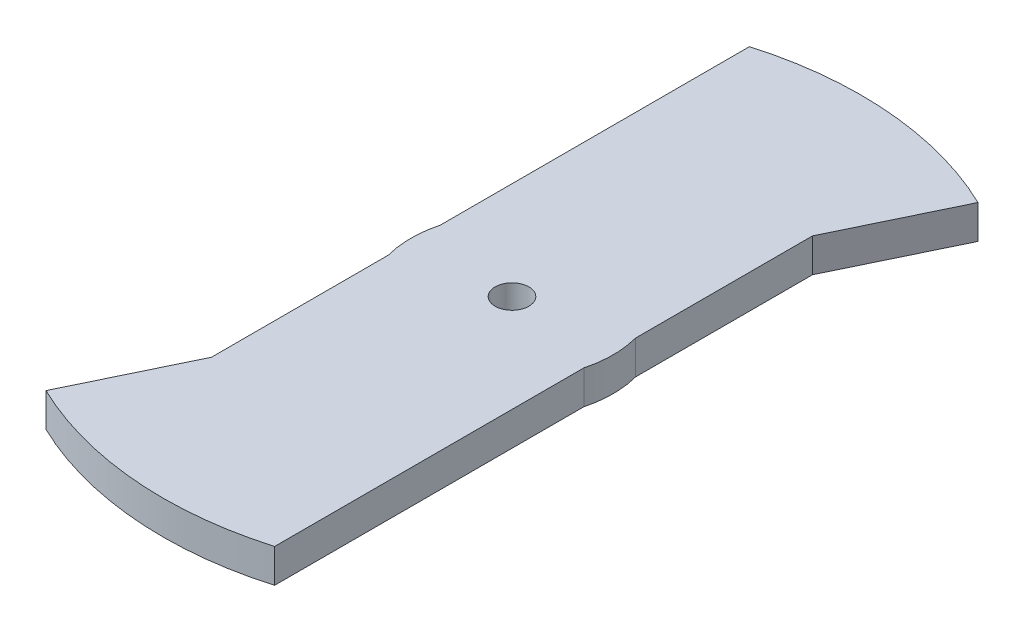
ISO-10303-21;
HEADER;
FILE_DESCRIPTION(('STEP AP214'),'2;1');
FILE_NAME('part.step','',(''),(''),'','','');
FILE_SCHEMA(('AUTOMOTIVE_DESIGN { 1 0 10303 214 1 1 1 1 }'));
ENDSEC;
DATA;
#1=APPLICATION_CONTEXT('core data for automotive mechanical design processes');
#2=APPLICATION_PROTOCOL_DEFINITION('international standard','automotive_design',2000,#1);
#3=PRODUCT_CONTEXT('',#1,'mechanical');
#4=PRODUCT('Part','Part','',(#3));
#5=PRODUCT_RELATED_PRODUCT_CATEGORY('part','',(#4));
#6=PRODUCT_DEFINITION_FORMATION('','',#4);
#7=PRODUCT_DEFINITION_CONTEXT('part definition',#1,'design');
#8=PRODUCT_DEFINITION('design','',#6,#7);
#9=PRODUCT_DEFINITION_SHAPE('','',#8);
#10=(LENGTH_UNIT() NAMED_UNIT(*) SI_UNIT(.MILLI.,.METRE.));
#11=(NAMED_UNIT(*) PLANE_ANGLE_UNIT() SI_UNIT($,.RADIAN.));
#12=(NAMED_UNIT(*) SI_UNIT($,.STERADIAN.) SOLID_ANGLE_UNIT());
#13=UNCERTAINTY_MEASURE_WITH_UNIT(LENGTH_MEASURE(1.E-05),#10,'distance_accuracy_value','');
#14=(GEOMETRIC_REPRESENTATION_CONTEXT(3) GLOBAL_UNCERTAINTY_ASSIGNED_CONTEXT((#13)) GLOBAL_UNIT_ASSIGNED_CONTEXT((#10,
#11,#12)) REPRESENTATION_CONTEXT('',''));
#15=CARTESIAN_POINT('',(0.,0.,0.));
#16=DIRECTION('',(0.,0.,1.));
#17=DIRECTION('',(1.,0.,0.));
#18=AXIS2_PLACEMENT_3D('',#15,#16,#17);
#19=CARTESIAN_POINT('',(0.,6.35,0.));
#20=DIRECTION('',(0.,-1.,0.));
#21=DIRECTION('',(0.,0.,-1.));
#22=AXIS2_PLACEMENT_3D('',#19,#20,#21);
#23=CYLINDRICAL_SURFACE('',#22,19.05);
#24=CARTESIAN_POINT('',(0.,0.,0.));
#25=DIRECTION('',(0.,1.,0.));
#26=DIRECTION('',(0.,0.,1.));
#27=AXIS2_PLACEMENT_3D('',#24,#25,#26);
#28=CIRCLE('',#27,19.05);
#29=CARTESIAN_POINT('',(18.415,0.,-4.87752754989657));
#30=VERTEX_POINT('',#29);
#31=CARTESIAN_POINT('',(18.415,0.,4.87752754989658));
#32=VERTEX_POINT('',#31);
#33=EDGE_CURVE('E147',#30,#32,#28,.F.);
#34=ORIENTED_EDGE('',*,*,#33,.F.);
#35=DIRECTION('',(0.,-1.,0.));
#36=VECTOR('',#35,1.);
#37=CARTESIAN_POINT('',(18.415,6.35,-4.87752754989657));
#38=LINE('',#37,#36);
#39=CARTESIAN_POINT('',(18.415,6.35,-4.87752754989657));
#40=VERTEX_POINT('',#39);
#41=EDGE_CURVE('E11',#40,#30,#38,.T.);
#42=ORIENTED_EDGE('',*,*,#41,.F.);
#43=CARTESIAN_POINT('',(0.,6.35,0.));
#44=DIRECTION('',(0.,1.,0.));
#45=DIRECTION('',(0.,0.,1.));
#46=AXIS2_PLACEMENT_3D('',#43,#44,#45);
#47=CIRCLE('',#46,19.05);
#48=CARTESIAN_POINT('',(18.415,6.35,4.87752754989658));
#49=VERTEX_POINT('',#48);
#50=EDGE_CURVE('E172',#40,#49,#47,.F.);
#51=ORIENTED_EDGE('',*,*,#50,.T.);
#52=DIRECTION('',(0.,-1.,0.));
#53=VECTOR('',#52,1.);
#54=CARTESIAN_POINT('',(18.415,6.35,4.87752754989658));
#55=LINE('',#54,#53);
#56=EDGE_CURVE('E93',#49,#32,#55,.T.);
#57=ORIENTED_EDGE('',*,*,#56,.T.);
#58=EDGE_LOOP('',(#34,#42,#51,#57));
#59=FACE_BOUND('',#58,.T.);
#60=ADVANCED_FACE('F37',(#59),#23,.T.);
#61=CARTESIAN_POINT('',(18.415,6.35,0.));
#62=DIRECTION('',(-1.,0.,0.));
#63=DIRECTION('',(0.,0.,1.));
#64=AXIS2_PLACEMENT_3D('',#61,#62,#63);
#65=PLANE('',#64);
#66=DIRECTION('',(0.,0.,-1.));
#67=VECTOR('',#66,1.);
#68=CARTESIAN_POINT('',(18.415,0.,0.));
#69=LINE('',#68,#67);
#70=CARTESIAN_POINT('',(18.415,0.,-38.2122297046378));
#71=VERTEX_POINT('',#70);
#72=EDGE_CURVE('E150',#30,#71,#69,.T.);
#73=ORIENTED_EDGE('',*,*,#72,.T.);
#74=DIRECTION('',(0.,-1.,0.));
#75=VECTOR('',#74,1.);
#76=CARTESIAN_POINT('',(18.415,6.35,-38.2122297046378));
#77=LINE('',#76,#75);
#78=CARTESIAN_POINT('',(18.415,6.35,-38.2122297046378));
#79=VERTEX_POINT('',#78);
#80=EDGE_CURVE('E45',#79,#71,#77,.T.);
#81=ORIENTED_EDGE('',*,*,#80,.F.);
#82=DIRECTION('',(0.,0.,-1.));
#83=VECTOR('',#82,1.);
#84=CARTESIAN_POINT('',(18.415,6.35,0.));
#85=LINE('',#84,#83);
#86=EDGE_CURVE('E211',#40,#79,#85,.T.);
#87=ORIENTED_EDGE('',*,*,#86,.F.);
#88=ORIENTED_EDGE('',*,*,#41,.T.);
#89=EDGE_LOOP('',(#73,#81,#87,#88));
#90=FACE_BOUND('',#89,.T.);
#91=ADVANCED_FACE('F225',(#90),#65,.F.);
#92=CARTESIAN_POINT('',(0.,6.35,0.));
#93=DIRECTION('',(-0.90084939659196,0.,-0.434131736526946));
#94=DIRECTION('',(-0.434131736526946,0.,0.90084939659196));
#95=AXIS2_PLACEMENT_3D('',#92,#93,#94);
#96=PLANE('',#95);
#97=DIRECTION('',(0.434131736526946,0.,-0.90084939659196));
#98=VECTOR('',#97,1.);
#99=CARTESIAN_POINT('',(0.,0.,0.));
#100=LINE('',#99,#98);
#101=CARTESIAN_POINT('',(28.5597904191617,0.,-59.2632784041987));
#102=VERTEX_POINT('',#101);
#103=EDGE_CURVE('E152',#71,#102,#100,.T.);
#104=ORIENTED_EDGE('',*,*,#103,.T.);
#105=DIRECTION('',(0.,-1.,0.));
#106=VECTOR('',#105,1.);
#107=CARTESIAN_POINT('',(28.5597904191617,6.35,-59.2632784041987));
#108=LINE('',#107,#106);
#109=CARTESIAN_POINT('',(28.5597904191617,6.35,-59.2632784041987));
#110=VERTEX_POINT('',#109);
#111=EDGE_CURVE('E184',#110,#102,#108,.T.);
#112=ORIENTED_EDGE('',*,*,#111,.F.);
#113=DIRECTION('',(0.434131736526946,0.,-0.90084939659196));
#114=VECTOR('',#113,1.);
#115=CARTESIAN_POINT('',(0.,6.35,0.));
#116=LINE('',#115,#114);
#117=EDGE_CURVE('E192',#79,#110,#116,.T.);
#118=ORIENTED_EDGE('',*,*,#117,.F.);
#119=ORIENTED_EDGE('',*,*,#80,.T.);
#120=EDGE_LOOP('',(#104,#112,#118,#119));
#121=FACE_BOUND('',#120,.T.);
#122=ADVANCED_FACE('F190',(#121),#96,.F.);
#123=CARTESIAN_POINT('',(0.,6.35,0.));
#124=DIRECTION('',(0.,-1.,0.));
#125=DIRECTION('',(0.,0.,-1.));
#126=AXIS2_PLACEMENT_3D('',#123,#124,#125);
#127=CYLINDRICAL_SURFACE('',#126,65.786);
#128=CARTESIAN_POINT('',(0.,0.,0.));
#129=DIRECTION('',(0.,1.,0.));
#130=DIRECTION('',(0.,0.,1.));
#131=AXIS2_PLACEMENT_3D('',#128,#129,#130);
#132=CIRCLE('',#131,65.786);
#133=CARTESIAN_POINT('',(-18.415,0.,-63.1560414449797));
#134=VERTEX_POINT('',#133);
#135=EDGE_CURVE('E155',#134,#102,#132,.F.);
#136=ORIENTED_EDGE('',*,*,#135,.F.);
#137=DIRECTION('',(0.,-1.,0.));
#138=VECTOR('',#137,1.);
#139=CARTESIAN_POINT('',(-18.415,6.35,-63.1560414449797));
#140=LINE('',#139,#138);
#141=CARTESIAN_POINT('',(-18.415,6.35,-63.1560414449797));
#142=VERTEX_POINT('',#141);
#143=EDGE_CURVE('E182',#142,#134,#140,.T.);
#144=ORIENTED_EDGE('',*,*,#143,.F.);
#145=CARTESIAN_POINT('',(0.,6.35,0.));
#146=DIRECTION('',(0.,1.,0.));
#147=DIRECTION('',(0.,0.,1.));
#148=AXIS2_PLACEMENT_3D('',#145,#146,#147);
#149=CIRCLE('',#148,65.786);
#150=EDGE_CURVE('E206',#142,#110,#149,.F.);
#151=ORIENTED_EDGE('',*,*,#150,.T.);
#152=ORIENTED_EDGE('',*,*,#111,.T.);
#153=EDGE_LOOP('',(#136,#144,#151,#152));
#154=FACE_BOUND('',#153,.T.);
#155=ADVANCED_FACE('F202',(#154),#127,.T.);
#156=CARTESIAN_POINT('',(-18.415,6.35,0.));
#157=DIRECTION('',(1.,0.,0.));
#158=DIRECTION('',(0.,0.,-1.));
#159=AXIS2_PLACEMENT_3D('',#156,#157,#158);
#160=PLANE('',#159);
#161=DIRECTION('',(0.,0.,1.));
#162=VECTOR('',#161,1.);
#163=CARTESIAN_POINT('',(-18.415,0.,0.));
#164=LINE('',#163,#162);
#165=CARTESIAN_POINT('',(-18.415,0.,-4.87752754989657));
#166=VERTEX_POINT('',#165);
#167=EDGE_CURVE('E158',#134,#166,#164,.T.);
#168=ORIENTED_EDGE('',*,*,#167,.T.);
#169=DIRECTION('',(0.,-1.,0.));
#170=VECTOR('',#169,1.);
#171=CARTESIAN_POINT('',(-18.415,6.35,-4.87752754989657));
#172=LINE('',#171,#170);
#173=CARTESIAN_POINT('',(-18.415,6.35,-4.87752754989657));
#174=VERTEX_POINT('',#173);
#175=EDGE_CURVE('E179',#174,#166,#172,.T.);
#176=ORIENTED_EDGE('',*,*,#175,.F.);
#177=DIRECTION('',(0.,0.,1.));
#178=VECTOR('',#177,1.);
#179=CARTESIAN_POINT('',(-18.415,6.35,0.));
#180=LINE('',#179,#178);
#181=EDGE_CURVE('E207',#142,#174,#180,.T.);
#182=ORIENTED_EDGE('',*,*,#181,.F.);
#183=ORIENTED_EDGE('',*,*,#143,.T.);
#184=EDGE_LOOP('',(#168,#176,#182,#183));
#185=FACE_BOUND('',#184,.T.);
#186=ADVANCED_FACE('F235',(#185),#160,.F.);
#187=CARTESIAN_POINT('',(0.,6.35,0.));
#188=DIRECTION('',(0.,-1.,0.));
#189=DIRECTION('',(0.,0.,-1.));
#190=AXIS2_PLACEMENT_3D('',#187,#188,#189);
#191=CYLINDRICAL_SURFACE('',#190,19.05);
#192=CARTESIAN_POINT('',(0.,0.,0.));
#193=DIRECTION('',(0.,1.,0.));
#194=DIRECTION('',(0.,0.,1.));
#195=AXIS2_PLACEMENT_3D('',#192,#193,#194);
#196=CIRCLE('',#195,19.05);
#197=CARTESIAN_POINT('',(-18.415,0.,4.87752754989657));
#198=VERTEX_POINT('',#197);
#199=EDGE_CURVE('E160',#166,#198,#196,.T.);
#200=ORIENTED_EDGE('',*,*,#199,.T.);
#201=DIRECTION('',(0.,-1.,0.));
#202=VECTOR('',#201,1.);
#203=CARTESIAN_POINT('',(-18.415,6.35,4.87752754989657));
#204=LINE('',#203,#202);
#205=CARTESIAN_POINT('',(-18.415,6.35,4.87752754989657));
#206=VERTEX_POINT('',#205);
#207=EDGE_CURVE('E176',#206,#198,#204,.T.);
#208=ORIENTED_EDGE('',*,*,#207,.F.);
#209=CARTESIAN_POINT('',(0.,6.35,0.));
#210=DIRECTION('',(0.,1.,0.));
#211=DIRECTION('',(0.,0.,1.));
#212=AXIS2_PLACEMENT_3D('',#209,#210,#211);
#213=CIRCLE('',#212,19.05);
#214=EDGE_CURVE('E209',#174,#206,#213,.T.);
#215=ORIENTED_EDGE('',*,*,#214,.F.);
#216=ORIENTED_EDGE('',*,*,#175,.T.);
#217=EDGE_LOOP('',(#200,#208,#215,#216));
#218=FACE_BOUND('',#217,.T.);
#219=ADVANCED_FACE('F219',(#218),#191,.T.);
#220=CARTESIAN_POINT('',(-18.415,6.35,0.));
#221=DIRECTION('',(1.,0.,0.));
#222=DIRECTION('',(0.,0.,-1.));
#223=AXIS2_PLACEMENT_3D('',#220,#221,#222);
#224=PLANE('',#223);
#225=DIRECTION('',(0.,0.,1.));
#226=VECTOR('',#225,1.);
#227=CARTESIAN_POINT('',(-18.415,0.,0.));
#228=LINE('',#227,#226);
#229=CARTESIAN_POINT('',(-18.415,0.,38.2122297046377));
#230=VERTEX_POINT('',#229);
#231=EDGE_CURVE('E162',#198,#230,#228,.T.);
#232=ORIENTED_EDGE('',*,*,#231,.T.);
#233=DIRECTION('',(0.,-1.,0.));
#234=VECTOR('',#233,1.);
#235=CARTESIAN_POINT('',(-18.415,6.35,38.2122297046377));
#236=LINE('',#235,#234);
#237=CARTESIAN_POINT('',(-18.415,6.35,38.2122297046377));
#238=VERTEX_POINT('',#237);
#239=EDGE_CURVE('E137',#238,#230,#236,.T.);
#240=ORIENTED_EDGE('',*,*,#239,.F.);
#241=DIRECTION('',(0.,0.,1.));
#242=VECTOR('',#241,1.);
#243=CARTESIAN_POINT('',(-18.415,6.35,0.));
#244=LINE('',#243,#242);
#245=EDGE_CURVE('E124',#206,#238,#244,.T.);
#246=ORIENTED_EDGE('',*,*,#245,.F.);
#247=ORIENTED_EDGE('',*,*,#207,.T.);
#248=EDGE_LOOP('',(#232,#240,#246,#247));
#249=FACE_BOUND('',#248,.T.);
#250=ADVANCED_FACE('F222',(#249),#224,.F.);
#251=CARTESIAN_POINT('',(0.,6.35,0.));
#252=DIRECTION('',(0.90084939659196,0.,0.434131736526947));
#253=DIRECTION('',(0.434131736526947,0.,-0.90084939659196));
#254=AXIS2_PLACEMENT_3D('',#251,#252,#253);
#255=PLANE('',#254);
#256=DIRECTION('',(-0.434131736526947,0.,0.90084939659196));
#257=VECTOR('',#256,1.);
#258=CARTESIAN_POINT('',(0.,0.,0.));
#259=LINE('',#258,#257);
#260=CARTESIAN_POINT('',(-28.5597904191617,0.,59.2632784041987));
#261=VERTEX_POINT('',#260);
#262=EDGE_CURVE('E133',#230,#261,#259,.T.);
#263=ORIENTED_EDGE('',*,*,#262,.T.);
#264=DIRECTION('',(0.,-1.,0.));
#265=VECTOR('',#264,1.);
#266=CARTESIAN_POINT('',(-28.5597904191617,6.35,59.2632784041987));
#267=LINE('',#266,#265);
#268=CARTESIAN_POINT('',(-28.5597904191617,6.35,59.2632784041987));
#269=VERTEX_POINT('',#268);
#270=EDGE_CURVE('E130',#269,#261,#267,.T.);
#271=ORIENTED_EDGE('',*,*,#270,.F.);
#272=DIRECTION('',(-0.434131736526947,0.,0.90084939659196));
#273=VECTOR('',#272,1.);
#274=CARTESIAN_POINT('',(0.,6.35,0.));
#275=LINE('',#274,#273);
#276=EDGE_CURVE('E117',#238,#269,#275,.T.);
#277=ORIENTED_EDGE('',*,*,#276,.F.);
#278=ORIENTED_EDGE('',*,*,#239,.T.);
#279=EDGE_LOOP('',(#263,#271,#277,#278));
#280=FACE_BOUND('',#279,.T.);
#281=ADVANCED_FACE('F131',(#280),#255,.F.);
#282=CARTESIAN_POINT('',(0.,6.35,0.));
#283=DIRECTION('',(0.,-1.,0.));
#284=DIRECTION('',(0.,0.,-1.));
#285=AXIS2_PLACEMENT_3D('',#282,#283,#284);
#286=CYLINDRICAL_SURFACE('',#285,65.786);
#287=CARTESIAN_POINT('',(0.,0.,0.));
#288=DIRECTION('',(0.,1.,0.));
#289=DIRECTION('',(0.,0.,1.));
#290=AXIS2_PLACEMENT_3D('',#287,#288,#289);
#291=CIRCLE('',#290,65.786);
#292=CARTESIAN_POINT('',(18.415,0.,63.1560414449798));
#293=VERTEX_POINT('',#292);
#294=EDGE_CURVE('E165',#293,#261,#291,.F.);
#295=ORIENTED_EDGE('',*,*,#294,.F.);
#296=DIRECTION('',(0.,-1.,0.));
#297=VECTOR('',#296,1.);
#298=CARTESIAN_POINT('',(18.415,6.35,63.1560414449798));
#299=LINE('',#298,#297);
#300=CARTESIAN_POINT('',(18.415,6.35,63.1560414449798));
#301=VERTEX_POINT('',#300);
#302=EDGE_CURVE('E86',#301,#293,#299,.T.);
#303=ORIENTED_EDGE('',*,*,#302,.F.);
#304=CARTESIAN_POINT('',(0.,6.35,0.));
#305=DIRECTION('',(0.,1.,0.));
#306=DIRECTION('',(0.,0.,1.));
#307=AXIS2_PLACEMENT_3D('',#304,#305,#306);
#308=CIRCLE('',#307,65.786);
#309=EDGE_CURVE('E122',#301,#269,#308,.F.);
#310=ORIENTED_EDGE('',*,*,#309,.T.);
#311=ORIENTED_EDGE('',*,*,#270,.T.);
#312=EDGE_LOOP('',(#295,#303,#310,#311));
#313=FACE_BOUND('',#312,.T.);
#314=ADVANCED_FACE('F139',(#313),#286,.T.);
#315=CARTESIAN_POINT('',(18.415,6.35,0.));
#316=DIRECTION('',(-1.,0.,0.));
#317=DIRECTION('',(0.,0.,1.));
#318=AXIS2_PLACEMENT_3D('',#315,#316,#317);
#319=PLANE('',#318);
#320=DIRECTION('',(0.,0.,-1.));
#321=VECTOR('',#320,1.);
#322=CARTESIAN_POINT('',(18.415,0.,0.));
#323=LINE('',#322,#321);
#324=EDGE_CURVE('E167',#293,#32,#323,.T.);
#325=ORIENTED_EDGE('',*,*,#324,.T.);
#326=ORIENTED_EDGE('',*,*,#56,.F.);
#327=DIRECTION('',(0.,0.,-1.));
#328=VECTOR('',#327,1.);
#329=CARTESIAN_POINT('',(18.415,6.35,0.));
#330=LINE('',#329,#328);
#331=EDGE_CURVE('E53',#301,#49,#330,.T.);
#332=ORIENTED_EDGE('',*,*,#331,.F.);
#333=ORIENTED_EDGE('',*,*,#302,.T.);
#334=EDGE_LOOP('',(#325,#326,#332,#333));
#335=FACE_BOUND('',#334,.T.);
#336=ADVANCED_FACE('F223',(#335),#319,.F.);
#337=CARTESIAN_POINT('',(0.,6.35,0.));
#338=DIRECTION('',(0.,-1.,0.));
#339=DIRECTION('',(0.,0.,-1.));
#340=AXIS2_PLACEMENT_3D('',#337,#338,#339);
#341=CYLINDRICAL_SURFACE('',#340,3.175);
#342=CARTESIAN_POINT('',(0.,6.35,0.));
#343=DIRECTION('',(0.,1.,0.));
#344=DIRECTION('',(0.,0.,1.));
#345=AXIS2_PLACEMENT_3D('',#342,#343,#344);
#346=CIRCLE('',#345,3.175);
#347=CARTESIAN_POINT('',(0.,6.35,3.175));
#348=VERTEX_POINT('',#347);
#349=EDGE_CURVE('E141',#348,#348,#346,.T.);
#350=ORIENTED_EDGE('',*,*,#349,.T.);
#351=EDGE_LOOP('',(#350));
#352=FACE_BOUND('',#351,.T.);
#353=CARTESIAN_POINT('',(0.,0.,0.));
#354=DIRECTION('',(0.,1.,0.));
#355=DIRECTION('',(0.,0.,1.));
#356=AXIS2_PLACEMENT_3D('',#353,#354,#355);
#357=CIRCLE('',#356,3.175);
#358=CARTESIAN_POINT('',(0.,0.,3.175));
#359=VERTEX_POINT('',#358);
#360=EDGE_CURVE('E169',#359,#359,#357,.T.);
#361=ORIENTED_EDGE('',*,*,#360,.F.);
#362=EDGE_LOOP('',(#361));
#363=FACE_BOUND('',#362,.T.);
#364=ADVANCED_FACE('F249',(#352,#363),#341,.F.);
#365=CARTESIAN_POINT('',(0.,6.35,0.));
#366=DIRECTION('',(0.,1.,0.));
#367=DIRECTION('',(0.,0.,1.));
#368=AXIS2_PLACEMENT_3D('',#365,#366,#367);
#369=PLANE('',#368);
#370=ORIENTED_EDGE('',*,*,#50,.F.);
#371=ORIENTED_EDGE('',*,*,#86,.T.);
#372=ORIENTED_EDGE('',*,*,#117,.T.);
#373=ORIENTED_EDGE('',*,*,#150,.F.);
#374=ORIENTED_EDGE('',*,*,#181,.T.);
#375=ORIENTED_EDGE('',*,*,#214,.T.);
#376=ORIENTED_EDGE('',*,*,#245,.T.);
#377=ORIENTED_EDGE('',*,*,#276,.T.);
#378=ORIENTED_EDGE('',*,*,#309,.F.);
#379=ORIENTED_EDGE('',*,*,#331,.T.);
#380=EDGE_LOOP('',(#370,#371,#372,#373,#374,#375,#376,#377,#378,#379));
#381=FACE_BOUND('',#380,.T.);
#382=ORIENTED_EDGE('',*,*,#349,.F.);
#383=EDGE_LOOP('',(#382));
#384=FACE_BOUND('',#383,.T.);
#385=ADVANCED_FACE('F119',(#381,#384),#369,.T.);
#386=CARTESIAN_POINT('',(0.,0.,0.));
#387=DIRECTION('',(0.,1.,0.));
#388=DIRECTION('',(0.,0.,1.));
#389=AXIS2_PLACEMENT_3D('',#386,#387,#388);
#390=PLANE('',#389);
#391=ORIENTED_EDGE('',*,*,#33,.T.);
#392=ORIENTED_EDGE('',*,*,#324,.F.);
#393=ORIENTED_EDGE('',*,*,#294,.T.);
#394=ORIENTED_EDGE('',*,*,#262,.F.);
#395=ORIENTED_EDGE('',*,*,#231,.F.);
#396=ORIENTED_EDGE('',*,*,#199,.F.);
#397=ORIENTED_EDGE('',*,*,#167,.F.);
#398=ORIENTED_EDGE('',*,*,#135,.T.);
#399=ORIENTED_EDGE('',*,*,#103,.F.);
#400=ORIENTED_EDGE('',*,*,#72,.F.);
#401=EDGE_LOOP('',(#391,#392,#393,#394,#395,#396,#397,#398,#399,#400));
#402=FACE_BOUND('',#401,.T.);
#403=ORIENTED_EDGE('',*,*,#360,.T.);
#404=EDGE_LOOP('',(#403));
#405=FACE_BOUND('',#404,.T.);
#406=ADVANCED_FACE('F196',(#402,#405),#390,.F.);
#407=CLOSED_SHELL('',(#60,#91,#122,#155,#186,#219,#250,#281,#314,#336,#364,#385,#406));
#408=MANIFOLD_SOLID_BREP('B2',#407);
#409=ADVANCED_BREP_SHAPE_REPRESENTATION('',(#18,#408),#14);
#410=SHAPE_DEFINITION_REPRESENTATION(#9,#409);
ENDSEC;
END-ISO-10303-21;
